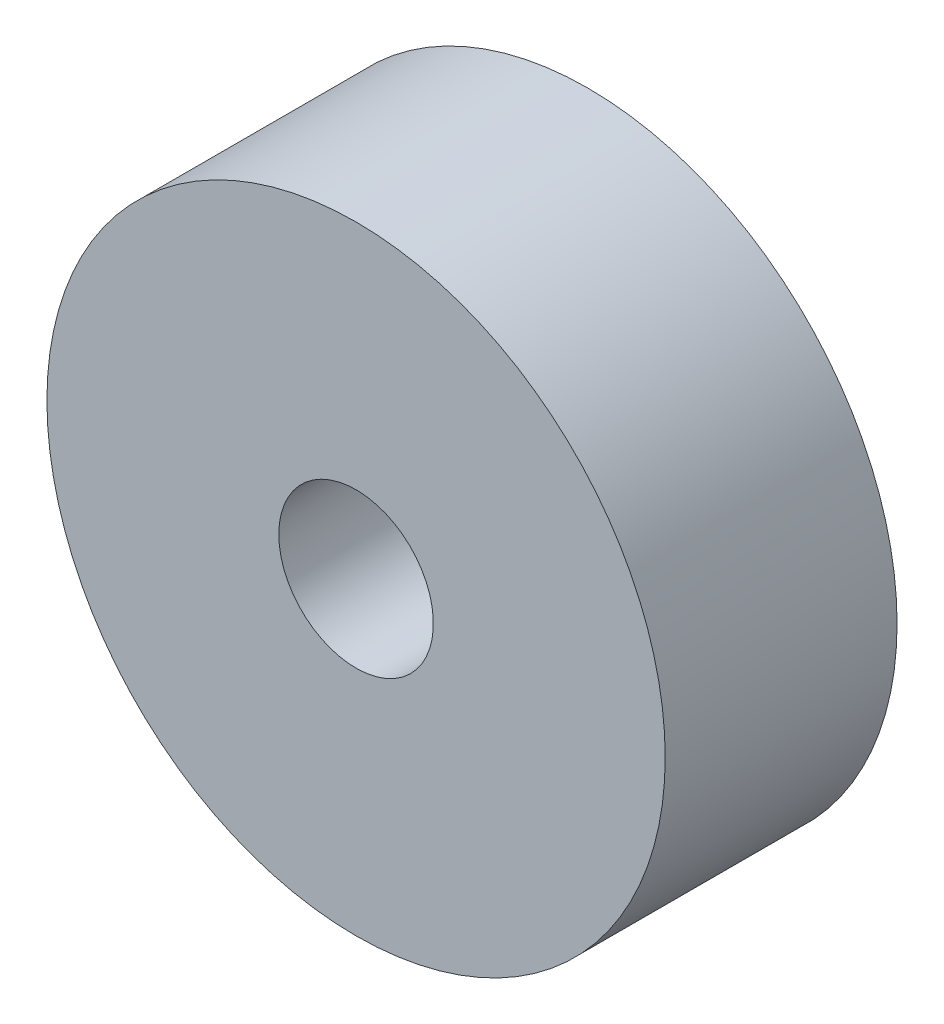
ISO-10303-21;
HEADER;
FILE_DESCRIPTION(('STEP AP214'),'2;1');
FILE_NAME('part.step','',(''),(''),'','','');
FILE_SCHEMA(('AUTOMOTIVE_DESIGN { 1 0 10303 214 1 1 1 1 }'));
ENDSEC;
DATA;
#1=APPLICATION_CONTEXT('core data for automotive mechanical design processes');
#2=APPLICATION_PROTOCOL_DEFINITION('international standard','automotive_design',2000,#1);
#3=PRODUCT_CONTEXT('',#1,'mechanical');
#4=PRODUCT('Part','Part','',(#3));
#5=PRODUCT_RELATED_PRODUCT_CATEGORY('part','',(#4));
#6=PRODUCT_DEFINITION_FORMATION('','',#4);
#7=PRODUCT_DEFINITION_CONTEXT('part definition',#1,'design');
#8=PRODUCT_DEFINITION('design','',#6,#7);
#9=PRODUCT_DEFINITION_SHAPE('','',#8);
#10=(LENGTH_UNIT() NAMED_UNIT(*) SI_UNIT(.MILLI.,.METRE.));
#11=(NAMED_UNIT(*) PLANE_ANGLE_UNIT() SI_UNIT($,.RADIAN.));
#12=(NAMED_UNIT(*) SI_UNIT($,.STERADIAN.) SOLID_ANGLE_UNIT());
#13=UNCERTAINTY_MEASURE_WITH_UNIT(LENGTH_MEASURE(1.E-05),#10,'distance_accuracy_value','');
#14=(GEOMETRIC_REPRESENTATION_CONTEXT(3) GLOBAL_UNCERTAINTY_ASSIGNED_CONTEXT((#13)) GLOBAL_UNIT_ASSIGNED_CONTEXT((#10,
#11,#12)) REPRESENTATION_CONTEXT('',''));
#15=CARTESIAN_POINT('',(0.,0.,0.));
#16=DIRECTION('',(0.,0.,1.));
#17=DIRECTION('',(1.,0.,0.));
#18=AXIS2_PLACEMENT_3D('',#15,#16,#17);
#19=CARTESIAN_POINT('',(0.,0.,38.1));
#20=DIRECTION('',(0.,0.,1.));
#21=DIRECTION('',(1.,0.,0.));
#22=AXIS2_PLACEMENT_3D('',#19,#20,#21);
#23=PLANE('',#22);
#24=CARTESIAN_POINT('',(0.,0.,38.1));
#25=DIRECTION('',(0.,0.,1.));
#26=DIRECTION('',(1.,0.,0.));
#27=AXIS2_PLACEMENT_3D('',#24,#25,#26);
#28=CIRCLE('',#27,50.8);
#29=CARTESIAN_POINT('',(-50.8,0.,38.1));
#30=VERTEX_POINT('',#29);
#31=EDGE_CURVE('E10',#30,#30,#28,.T.);
#32=ORIENTED_EDGE('',*,*,#31,.T.);
#33=EDGE_LOOP('',(#32));
#34=FACE_BOUND('',#33,.T.);
#35=CARTESIAN_POINT('',(0.,0.,38.1));
#36=DIRECTION('',(0.,0.,1.));
#37=DIRECTION('',(1.,0.,0.));
#38=AXIS2_PLACEMENT_3D('',#35,#36,#37);
#39=CIRCLE('',#38,12.7);
#40=CARTESIAN_POINT('',(-12.7,0.,38.1));
#41=VERTEX_POINT('',#40);
#42=EDGE_CURVE('E45',#41,#41,#39,.T.);
#43=ORIENTED_EDGE('',*,*,#42,.F.);
#44=EDGE_LOOP('',(#43));
#45=FACE_BOUND('',#44,.T.);
#46=ADVANCED_FACE('F34',(#34,#45),#23,.T.);
#47=CARTESIAN_POINT('',(0.,0.,0.));
#48=DIRECTION('',(0.,0.,1.));
#49=DIRECTION('',(1.,0.,0.));
#50=AXIS2_PLACEMENT_3D('',#47,#48,#49);
#51=PLANE('',#50);
#52=CARTESIAN_POINT('',(0.,0.,0.));
#53=DIRECTION('',(0.,0.,1.));
#54=DIRECTION('',(1.,0.,0.));
#55=AXIS2_PLACEMENT_3D('',#52,#53,#54);
#56=CIRCLE('',#55,50.8);
#57=CARTESIAN_POINT('',(-50.8,0.,0.));
#58=VERTEX_POINT('',#57);
#59=EDGE_CURVE('E38',#58,#58,#56,.T.);
#60=ORIENTED_EDGE('',*,*,#59,.F.);
#61=EDGE_LOOP('',(#60));
#62=FACE_BOUND('',#61,.T.);
#63=CARTESIAN_POINT('',(0.,0.,0.));
#64=DIRECTION('',(0.,0.,1.));
#65=DIRECTION('',(1.,0.,0.));
#66=AXIS2_PLACEMENT_3D('',#63,#64,#65);
#67=CIRCLE('',#66,12.7);
#68=CARTESIAN_POINT('',(-12.7,0.,0.));
#69=VERTEX_POINT('',#68);
#70=EDGE_CURVE('E47',#69,#69,#67,.T.);
#71=ORIENTED_EDGE('',*,*,#70,.T.);
#72=EDGE_LOOP('',(#71));
#73=FACE_BOUND('',#72,.T.);
#74=ADVANCED_FACE('F57',(#62,#73),#51,.F.);
#75=CARTESIAN_POINT('',(0.,0.,38.1));
#76=DIRECTION('',(0.,0.,-1.));
#77=DIRECTION('',(-1.,0.,0.));
#78=AXIS2_PLACEMENT_3D('',#75,#76,#77);
#79=CYLINDRICAL_SURFACE('',#78,50.8);
#80=CARTESIAN_POINT('',(-50.8,0.,38.1));
#81=CARTESIAN_POINT('',(-50.8,0.,37.703125));
#82=CARTESIAN_POINT('',(-50.8,0.,37.30625));
#83=CARTESIAN_POINT('',(-50.8,0.,36.5125));
#84=CARTESIAN_POINT('',(-50.8,0.,36.115625));
#85=CARTESIAN_POINT('',(-50.8,0.,35.321875));
#86=CARTESIAN_POINT('',(-50.8,0.,34.925));
#87=CARTESIAN_POINT('',(-50.8,0.,34.13125));
#88=CARTESIAN_POINT('',(-50.8,0.,33.734375));
#89=CARTESIAN_POINT('',(-50.8,0.,32.940625));
#90=CARTESIAN_POINT('',(-50.8,0.,32.54375));
#91=CARTESIAN_POINT('',(-50.8,0.,31.75));
#92=CARTESIAN_POINT('',(-50.8,0.,31.353125));
#93=CARTESIAN_POINT('',(-50.8,0.,30.559375));
#94=CARTESIAN_POINT('',(-50.8,0.,30.1625));
#95=CARTESIAN_POINT('',(-50.8,0.,29.36875));
#96=CARTESIAN_POINT('',(-50.8,0.,28.971875));
#97=CARTESIAN_POINT('',(-50.8,0.,28.178125));
#98=CARTESIAN_POINT('',(-50.8,0.,27.78125));
#99=CARTESIAN_POINT('',(-50.8,0.,26.9875));
#100=CARTESIAN_POINT('',(-50.8,0.,26.590625));
#101=CARTESIAN_POINT('',(-50.8,0.,25.796875));
#102=CARTESIAN_POINT('',(-50.8,0.,25.4));
#103=CARTESIAN_POINT('',(-50.8,0.,24.60625));
#104=CARTESIAN_POINT('',(-50.8,0.,24.209375));
#105=CARTESIAN_POINT('',(-50.8,0.,23.415625));
#106=CARTESIAN_POINT('',(-50.8,0.,23.01875));
#107=CARTESIAN_POINT('',(-50.8,0.,22.225));
#108=CARTESIAN_POINT('',(-50.8,0.,21.828125));
#109=CARTESIAN_POINT('',(-50.8,0.,21.034375));
#110=CARTESIAN_POINT('',(-50.8,0.,20.6375));
#111=CARTESIAN_POINT('',(-50.8,0.,19.84375));
#112=CARTESIAN_POINT('',(-50.8,0.,19.446875));
#113=CARTESIAN_POINT('',(-50.8,0.,18.653125));
#114=CARTESIAN_POINT('',(-50.8,0.,18.25625));
#115=CARTESIAN_POINT('',(-50.8,0.,17.4625));
#116=CARTESIAN_POINT('',(-50.8,0.,17.065625));
#117=CARTESIAN_POINT('',(-50.8,0.,16.271875));
#118=CARTESIAN_POINT('',(-50.8,0.,15.875));
#119=CARTESIAN_POINT('',(-50.8,0.,15.08125));
#120=CARTESIAN_POINT('',(-50.8,0.,14.684375));
#121=CARTESIAN_POINT('',(-50.8,0.,13.890625));
#122=CARTESIAN_POINT('',(-50.8,0.,13.49375));
#123=CARTESIAN_POINT('',(-50.8,0.,12.7));
#124=CARTESIAN_POINT('',(-50.8,0.,12.303125));
#125=CARTESIAN_POINT('',(-50.8,0.,11.509375));
#126=CARTESIAN_POINT('',(-50.8,0.,11.1125));
#127=CARTESIAN_POINT('',(-50.8,0.,10.31875));
#128=CARTESIAN_POINT('',(-50.8,0.,9.92187499999999));
#129=CARTESIAN_POINT('',(-50.8,0.,9.128125));
#130=CARTESIAN_POINT('',(-50.8,0.,8.73124999999999));
#131=CARTESIAN_POINT('',(-50.8,0.,7.93749999999999));
#132=CARTESIAN_POINT('',(-50.8,0.,7.54062499999999));
#133=CARTESIAN_POINT('',(-50.8,0.,6.746875));
#134=CARTESIAN_POINT('',(-50.8,0.,6.35));
#135=CARTESIAN_POINT('',(-50.8,0.,5.55625));
#136=CARTESIAN_POINT('',(-50.8,0.,5.159375));
#137=CARTESIAN_POINT('',(-50.8,0.,4.365625));
#138=CARTESIAN_POINT('',(-50.8,0.,3.96875));
#139=CARTESIAN_POINT('',(-50.8,0.,3.175));
#140=CARTESIAN_POINT('',(-50.8,0.,2.778125));
#141=CARTESIAN_POINT('',(-50.8,0.,1.984375));
#142=CARTESIAN_POINT('',(-50.8,0.,1.5875));
#143=CARTESIAN_POINT('',(-50.8,0.,0.79375));
#144=CARTESIAN_POINT('',(-50.8,0.,0.396875));
#145=CARTESIAN_POINT('',(-50.8,0.,0.));
#146=B_SPLINE_CURVE_WITH_KNOTS('',3,(#80,#81,#82,#83,#84,#85,#86,#87,#88,#89,#90,#91,#92,#93,
#94,#95,#96,#97,#98,#99,#100,#101,#102,#103,#104,#105,#106,#107,#108,#109,#110,#111,#112,#113,
#114,#115,#116,#117,#118,#119,#120,#121,#122,#123,#124,#125,#126,#127,#128,#129,#130,#131,#132,
#133,#134,#135,#136,#137,#138,#139,#140,#141,#142,#143,#144,#145),.UNSPECIFIED.,.F.,.F.,(4,2,2,
2,2,2,2,2,2,2,2,2,2,2,2,2,2,2,2,2,2,2,2,2,2,2,2,2,2,2,2,2,4),(0.,1.190625,2.38125,3.571875,
4.7625,5.953125,7.14375,8.334375,9.52500000000001,10.715625,11.90625,13.096875,14.2875,
15.478125,16.66875,17.859375,19.05,20.240625,21.43125,22.621875,23.8125,25.003125,26.19375,
27.384375,28.575,29.765625,30.95625,32.146875,33.3375,34.528125,35.71875,36.909375,38.1),.UNSPECIFIED.);
#147=EDGE_CURVE('BSEAM36',#30,#58,#146,.T.);
#148=ORIENTED_EDGE('',*,*,#31,.F.);
#149=ORIENTED_EDGE('',*,*,#59,.T.);
#150=ORIENTED_EDGE('',*,*,#147,.T.);
#151=ORIENTED_EDGE('',*,*,#147,.F.);
#152=EDGE_LOOP('',(#148,#150,#149,#151));
#153=FACE_BOUND('',#152,.T.);
#154=ADVANCED_FACE('F36',(#153),#79,.T.);
#155=CARTESIAN_POINT('',(0.,0.,38.1));
#156=DIRECTION('',(0.,0.,-1.));
#157=DIRECTION('',(-1.,0.,0.));
#158=AXIS2_PLACEMENT_3D('',#155,#156,#157);
#159=CYLINDRICAL_SURFACE('',#158,12.7);
#160=CARTESIAN_POINT('',(-12.7,0.,38.1));
#161=CARTESIAN_POINT('',(-12.7,0.,37.703125));
#162=CARTESIAN_POINT('',(-12.7,0.,37.30625));
#163=CARTESIAN_POINT('',(-12.7,0.,36.5125));
#164=CARTESIAN_POINT('',(-12.7,0.,36.115625));
#165=CARTESIAN_POINT('',(-12.7,0.,35.321875));
#166=CARTESIAN_POINT('',(-12.7,0.,34.925));
#167=CARTESIAN_POINT('',(-12.7,0.,34.13125));
#168=CARTESIAN_POINT('',(-12.7,0.,33.734375));
#169=CARTESIAN_POINT('',(-12.7,0.,32.940625));
#170=CARTESIAN_POINT('',(-12.7,0.,32.54375));
#171=CARTESIAN_POINT('',(-12.7,0.,31.75));
#172=CARTESIAN_POINT('',(-12.7,0.,31.353125));
#173=CARTESIAN_POINT('',(-12.7,0.,30.559375));
#174=CARTESIAN_POINT('',(-12.7,0.,30.1625));
#175=CARTESIAN_POINT('',(-12.7,0.,29.36875));
#176=CARTESIAN_POINT('',(-12.7,0.,28.971875));
#177=CARTESIAN_POINT('',(-12.7,0.,28.178125));
#178=CARTESIAN_POINT('',(-12.7,0.,27.78125));
#179=CARTESIAN_POINT('',(-12.7,0.,26.9875));
#180=CARTESIAN_POINT('',(-12.7,0.,26.590625));
#181=CARTESIAN_POINT('',(-12.7,0.,25.796875));
#182=CARTESIAN_POINT('',(-12.7,0.,25.4));
#183=CARTESIAN_POINT('',(-12.7,0.,24.60625));
#184=CARTESIAN_POINT('',(-12.7,0.,24.209375));
#185=CARTESIAN_POINT('',(-12.7,0.,23.415625));
#186=CARTESIAN_POINT('',(-12.7,0.,23.01875));
#187=CARTESIAN_POINT('',(-12.7,0.,22.225));
#188=CARTESIAN_POINT('',(-12.7,0.,21.828125));
#189=CARTESIAN_POINT('',(-12.7,0.,21.034375));
#190=CARTESIAN_POINT('',(-12.7,0.,20.6375));
#191=CARTESIAN_POINT('',(-12.7,0.,19.84375));
#192=CARTESIAN_POINT('',(-12.7,0.,19.446875));
#193=CARTESIAN_POINT('',(-12.7,0.,18.653125));
#194=CARTESIAN_POINT('',(-12.7,0.,18.25625));
#195=CARTESIAN_POINT('',(-12.7,0.,17.4625));
#196=CARTESIAN_POINT('',(-12.7,0.,17.065625));
#197=CARTESIAN_POINT('',(-12.7,0.,16.271875));
#198=CARTESIAN_POINT('',(-12.7,0.,15.875));
#199=CARTESIAN_POINT('',(-12.7,0.,15.08125));
#200=CARTESIAN_POINT('',(-12.7,0.,14.684375));
#201=CARTESIAN_POINT('',(-12.7,0.,13.890625));
#202=CARTESIAN_POINT('',(-12.7,0.,13.49375));
#203=CARTESIAN_POINT('',(-12.7,0.,12.7));
#204=CARTESIAN_POINT('',(-12.7,0.,12.303125));
#205=CARTESIAN_POINT('',(-12.7,0.,11.509375));
#206=CARTESIAN_POINT('',(-12.7,0.,11.1125));
#207=CARTESIAN_POINT('',(-12.7,0.,10.31875));
#208=CARTESIAN_POINT('',(-12.7,0.,9.92187499999999));
#209=CARTESIAN_POINT('',(-12.7,0.,9.128125));
#210=CARTESIAN_POINT('',(-12.7,0.,8.73124999999999));
#211=CARTESIAN_POINT('',(-12.7,0.,7.93749999999999));
#212=CARTESIAN_POINT('',(-12.7,0.,7.54062499999999));
#213=CARTESIAN_POINT('',(-12.7,0.,6.746875));
#214=CARTESIAN_POINT('',(-12.7,0.,6.35));
#215=CARTESIAN_POINT('',(-12.7,0.,5.55625));
#216=CARTESIAN_POINT('',(-12.7,0.,5.159375));
#217=CARTESIAN_POINT('',(-12.7,0.,4.365625));
#218=CARTESIAN_POINT('',(-12.7,0.,3.96875));
#219=CARTESIAN_POINT('',(-12.7,0.,3.175));
#220=CARTESIAN_POINT('',(-12.7,0.,2.778125));
#221=CARTESIAN_POINT('',(-12.7,0.,1.984375));
#222=CARTESIAN_POINT('',(-12.7,0.,1.5875));
#223=CARTESIAN_POINT('',(-12.7,0.,0.79375));
#224=CARTESIAN_POINT('',(-12.7,0.,0.396875));
#225=CARTESIAN_POINT('',(-12.7,0.,0.));
#226=B_SPLINE_CURVE_WITH_KNOTS('',3,(#160,#161,#162,#163,#164,#165,#166,#167,#168,#169,#170,
#171,#172,#173,#174,#175,#176,#177,#178,#179,#180,#181,#182,#183,#184,#185,#186,#187,#188,#189,
#190,#191,#192,#193,#194,#195,#196,#197,#198,#199,#200,#201,#202,#203,#204,#205,#206,#207,#208,
#209,#210,#211,#212,#213,#214,#215,#216,#217,#218,#219,#220,#221,#222,#223,#224,#225),
.UNSPECIFIED.,.F.,.F.,(4,2,2,2,2,2,2,2,2,2,2,2,2,2,2,2,2,2,2,2,2,2,2,2,2,2,2,2,2,2,2,2,4),(0.,
1.190625,2.38125,3.571875,4.7625,5.953125,7.14375,8.334375,9.52500000000001,10.715625,11.90625,
13.096875,14.2875,15.478125,16.66875,17.859375,19.05,20.240625,21.43125,22.621875,23.8125,
25.003125,26.19375,27.384375,28.575,29.765625,30.95625,32.146875,33.3375,34.528125,35.71875,
36.909375,38.1),.UNSPECIFIED.);
#227=EDGE_CURVE('BSEAM53',#41,#69,#226,.T.);
#228=ORIENTED_EDGE('',*,*,#42,.T.);
#229=ORIENTED_EDGE('',*,*,#70,.F.);
#230=ORIENTED_EDGE('',*,*,#227,.T.);
#231=ORIENTED_EDGE('',*,*,#227,.F.);
#232=EDGE_LOOP('',(#228,#230,#229,#231));
#233=FACE_BOUND('',#232,.T.);
#234=ADVANCED_FACE('F53',(#233),#159,.F.);
#235=CLOSED_SHELL('',(#46,#74,#154,#234));
#236=MANIFOLD_SOLID_BREP('B2',#235);
#237=ADVANCED_BREP_SHAPE_REPRESENTATION('',(#18,#236),#14);
#238=SHAPE_DEFINITION_REPRESENTATION(#9,#237);
ENDSEC;
END-ISO-10303-21;
